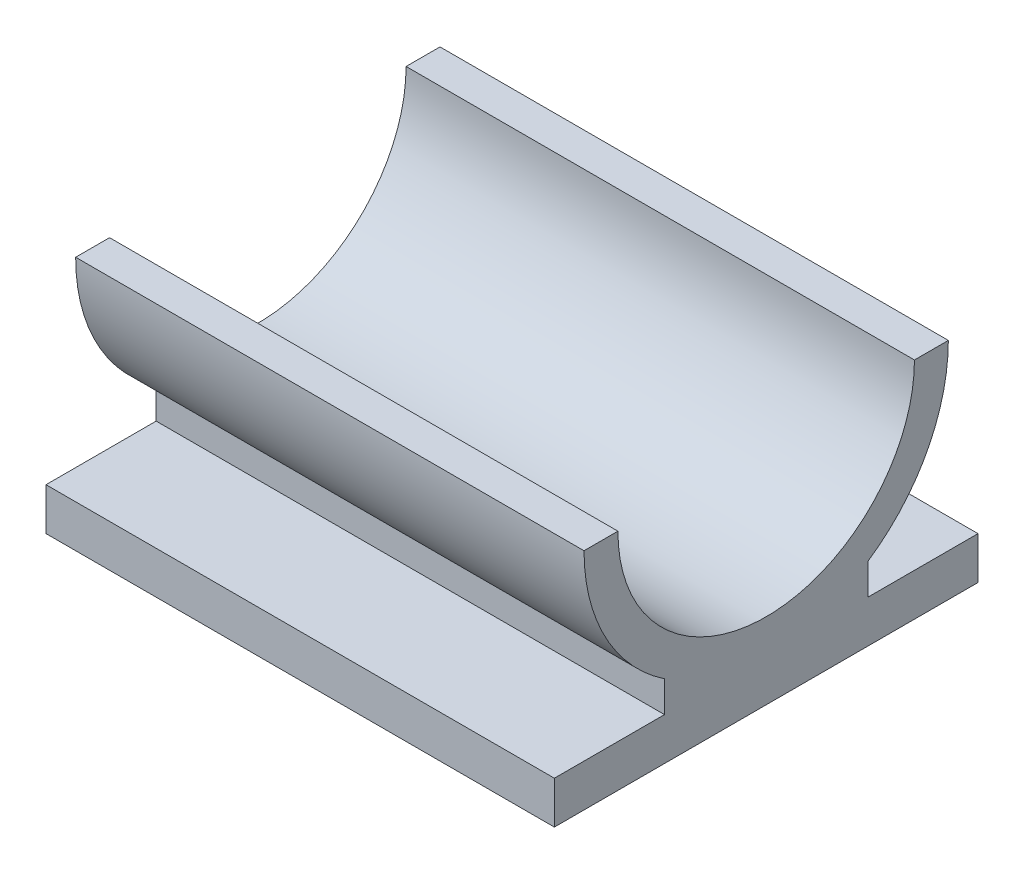
ISO-10303-21;
HEADER;
FILE_DESCRIPTION(('STEP AP214'),'2;1');
FILE_NAME('part.step','',(''),(''),'','','');
FILE_SCHEMA(('AUTOMOTIVE_DESIGN { 1 0 10303 214 1 1 1 1 }'));
ENDSEC;
DATA;
#1=APPLICATION_CONTEXT('core data for automotive mechanical design processes');
#2=APPLICATION_PROTOCOL_DEFINITION('international standard','automotive_design',2000,#1);
#3=PRODUCT_CONTEXT('',#1,'mechanical');
#4=PRODUCT('Part','Part','',(#3));
#5=PRODUCT_RELATED_PRODUCT_CATEGORY('part','',(#4));
#6=PRODUCT_DEFINITION_FORMATION('','',#4);
#7=PRODUCT_DEFINITION_CONTEXT('part definition',#1,'design');
#8=PRODUCT_DEFINITION('design','',#6,#7);
#9=PRODUCT_DEFINITION_SHAPE('','',#8);
#10=(LENGTH_UNIT() NAMED_UNIT(*) SI_UNIT(.MILLI.,.METRE.));
#11=(NAMED_UNIT(*) PLANE_ANGLE_UNIT() SI_UNIT($,.RADIAN.));
#12=(NAMED_UNIT(*) SI_UNIT($,.STERADIAN.) SOLID_ANGLE_UNIT());
#13=UNCERTAINTY_MEASURE_WITH_UNIT(LENGTH_MEASURE(1.E-05),#10,'distance_accuracy_value','');
#14=(GEOMETRIC_REPRESENTATION_CONTEXT(3) GLOBAL_UNCERTAINTY_ASSIGNED_CONTEXT((#13)) GLOBAL_UNIT_ASSIGNED_CONTEXT((#10,
#11,#12)) REPRESENTATION_CONTEXT('',''));
#15=CARTESIAN_POINT('',(0.,0.,0.));
#16=DIRECTION('',(0.,0.,1.));
#17=DIRECTION('',(1.,0.,0.));
#18=AXIS2_PLACEMENT_3D('',#15,#16,#17);
#19=CARTESIAN_POINT('',(0.,6.35,0.));
#20=DIRECTION('',(0.,-1.,0.));
#21=DIRECTION('',(0.,0.,-1.));
#22=AXIS2_PLACEMENT_3D('',#19,#20,#21);
#23=PLANE('',#22);
#24=DIRECTION('',(1.,0.,0.));
#25=VECTOR('',#24,1.);
#26=CARTESIAN_POINT('',(-38.1,6.35,15.24));
#27=LINE('',#26,#25);
#28=CARTESIAN_POINT('',(-38.1,6.35,15.24));
#29=VERTEX_POINT('',#28);
#30=CARTESIAN_POINT('',(38.1,6.35,15.24));
#31=VERTEX_POINT('',#30);
#32=EDGE_CURVE('E191',#29,#31,#27,.T.);
#33=ORIENTED_EDGE('',*,*,#32,.F.);
#34=DIRECTION('',(0.,0.,1.));
#35=VECTOR('',#34,1.);
#36=CARTESIAN_POINT('',(-38.1,6.35,31.75));
#37=LINE('',#36,#35);
#38=CARTESIAN_POINT('',(-38.1,6.35,31.75));
#39=VERTEX_POINT('',#38);
#40=EDGE_CURVE('E203',#29,#39,#37,.T.);
#41=ORIENTED_EDGE('',*,*,#40,.T.);
#42=DIRECTION('',(1.,0.,0.));
#43=VECTOR('',#42,1.);
#44=CARTESIAN_POINT('',(-38.1,6.35,31.75));
#45=LINE('',#44,#43);
#46=CARTESIAN_POINT('',(38.1,6.35,31.75));
#47=VERTEX_POINT('',#46);
#48=EDGE_CURVE('E63',#39,#47,#45,.T.);
#49=ORIENTED_EDGE('',*,*,#48,.T.);
#50=DIRECTION('',(0.,0.,-1.));
#51=VECTOR('',#50,1.);
#52=CARTESIAN_POINT('',(38.1,6.35,31.75));
#53=LINE('',#52,#51);
#54=EDGE_CURVE('E199',#47,#31,#53,.T.);
#55=ORIENTED_EDGE('',*,*,#54,.T.);
#56=EDGE_LOOP('',(#33,#41,#49,#55));
#57=FACE_BOUND('',#56,.T.);
#58=ADVANCED_FACE('F39',(#57),#23,.F.);
#59=CARTESIAN_POINT('',(38.1,6.35,31.75));
#60=DIRECTION('',(-1.,0.,0.));
#61=DIRECTION('',(0.,0.,1.));
#62=AXIS2_PLACEMENT_3D('',#59,#60,#61);
#63=PLANE('',#62);
#64=DIRECTION('',(0.,1.,0.));
#65=VECTOR('',#64,1.);
#66=CARTESIAN_POINT('',(38.1,11.176,-15.24));
#67=LINE('',#66,#65);
#68=CARTESIAN_POINT('',(38.1,6.35,-15.24));
#69=VERTEX_POINT('',#68);
#70=CARTESIAN_POINT('',(38.1,10.9987552758627,-15.24));
#71=VERTEX_POINT('',#70);
#72=EDGE_CURVE('E54',#69,#71,#67,.T.);
#73=ORIENTED_EDGE('',*,*,#72,.T.);
#74=CARTESIAN_POINT('',(38.1,33.655,0.));
#75=DIRECTION('',(1.,0.,0.));
#76=DIRECTION('',(0.,0.,-1.));
#77=AXIS2_PLACEMENT_3D('',#74,#75,#76);
#78=CIRCLE('',#77,27.305);
#79=CARTESIAN_POINT('',(38.1,33.655,-27.305));
#80=VERTEX_POINT('',#79);
#81=EDGE_CURVE('E175',#71,#80,#78,.T.);
#82=ORIENTED_EDGE('',*,*,#81,.T.);
#83=DIRECTION('',(0.,0.,1.));
#84=VECTOR('',#83,1.);
#85=CARTESIAN_POINT('',(38.1,33.655,-22.225));
#86=LINE('',#85,#84);
#87=CARTESIAN_POINT('',(38.1,33.655,-22.225));
#88=VERTEX_POINT('',#87);
#89=EDGE_CURVE('E164',#80,#88,#86,.T.);
#90=ORIENTED_EDGE('',*,*,#89,.T.);
#91=CARTESIAN_POINT('',(38.1,33.655,0.));
#92=DIRECTION('',(-1.,0.,0.));
#93=DIRECTION('',(0.,0.,-1.));
#94=AXIS2_PLACEMENT_3D('',#91,#92,#93);
#95=CIRCLE('',#94,22.225);
#96=CARTESIAN_POINT('',(38.1,33.655,22.225));
#97=VERTEX_POINT('',#96);
#98=EDGE_CURVE('E172',#88,#97,#95,.T.);
#99=ORIENTED_EDGE('',*,*,#98,.T.);
#100=DIRECTION('',(0.,0.,1.));
#101=VECTOR('',#100,1.);
#102=CARTESIAN_POINT('',(38.1,33.655,27.305));
#103=LINE('',#102,#101);
#104=CARTESIAN_POINT('',(38.1,33.655,27.305));
#105=VERTEX_POINT('',#104);
#106=EDGE_CURVE('E143',#97,#105,#103,.T.);
#107=ORIENTED_EDGE('',*,*,#106,.T.);
#108=CARTESIAN_POINT('',(38.1,10.9987552758627,15.24));
#109=VERTEX_POINT('',#108);
#110=EDGE_CURVE('E167',#105,#109,#78,.T.);
#111=ORIENTED_EDGE('',*,*,#110,.T.);
#112=DIRECTION('',(0.,-1.,0.));
#113=VECTOR('',#112,1.);
#114=CARTESIAN_POINT('',(38.1,11.176,15.24));
#115=LINE('',#114,#113);
#116=EDGE_CURVE('E189',#109,#31,#115,.T.);
#117=ORIENTED_EDGE('',*,*,#116,.T.);
#118=ORIENTED_EDGE('',*,*,#54,.F.);
#119=DIRECTION('',(0.,-1.,0.));
#120=VECTOR('',#119,1.);
#121=CARTESIAN_POINT('',(38.1,6.35,31.75));
#122=LINE('',#121,#120);
#123=CARTESIAN_POINT('',(38.1,0.,31.75));
#124=VERTEX_POINT('',#123);
#125=EDGE_CURVE('E208',#47,#124,#122,.T.);
#126=ORIENTED_EDGE('',*,*,#125,.T.);
#127=DIRECTION('',(0.,0.,-1.));
#128=VECTOR('',#127,1.);
#129=CARTESIAN_POINT('',(38.1,0.,31.75));
#130=LINE('',#129,#128);
#131=CARTESIAN_POINT('',(38.1,0.,-31.75));
#132=VERTEX_POINT('',#131);
#133=EDGE_CURVE('E196',#124,#132,#130,.T.);
#134=ORIENTED_EDGE('',*,*,#133,.T.);
#135=DIRECTION('',(0.,-1.,0.));
#136=VECTOR('',#135,1.);
#137=CARTESIAN_POINT('',(38.1,6.35,-31.75));
#138=LINE('',#137,#136);
#139=CARTESIAN_POINT('',(38.1,6.35,-31.75));
#140=VERTEX_POINT('',#139);
#141=EDGE_CURVE('E47',#140,#132,#138,.T.);
#142=ORIENTED_EDGE('',*,*,#141,.F.);
#143=EDGE_CURVE('E91',#69,#140,#53,.T.);
#144=ORIENTED_EDGE('',*,*,#143,.F.);
#145=EDGE_LOOP('',(#73,#82,#90,#99,#107,#111,#117,#118,#126,#134,#142,#144));
#146=FACE_BOUND('',#145,.T.);
#147=ADVANCED_FACE('F41',(#146),#63,.F.);
#148=CARTESIAN_POINT('',(-38.1,6.35,-31.75));
#149=DIRECTION('',(0.,0.,1.));
#150=DIRECTION('',(1.,0.,0.));
#151=AXIS2_PLACEMENT_3D('',#148,#149,#150);
#152=PLANE('',#151);
#153=DIRECTION('',(-1.,0.,0.));
#154=VECTOR('',#153,1.);
#155=CARTESIAN_POINT('',(-38.1,0.,-31.75));
#156=LINE('',#155,#154);
#157=CARTESIAN_POINT('',(-38.1,0.,-31.75));
#158=VERTEX_POINT('',#157);
#159=EDGE_CURVE('E211',#132,#158,#156,.T.);
#160=ORIENTED_EDGE('',*,*,#159,.T.);
#161=DIRECTION('',(0.,-1.,0.));
#162=VECTOR('',#161,1.);
#163=CARTESIAN_POINT('',(-38.1,6.35,-31.75));
#164=LINE('',#163,#162);
#165=CARTESIAN_POINT('',(-38.1,6.35,-31.75));
#166=VERTEX_POINT('',#165);
#167=EDGE_CURVE('E219',#166,#158,#164,.T.);
#168=ORIENTED_EDGE('',*,*,#167,.F.);
#169=DIRECTION('',(-1.,0.,0.));
#170=VECTOR('',#169,1.);
#171=CARTESIAN_POINT('',(-38.1,6.35,-31.75));
#172=LINE('',#171,#170);
#173=EDGE_CURVE('E201',#140,#166,#172,.T.);
#174=ORIENTED_EDGE('',*,*,#173,.F.);
#175=ORIENTED_EDGE('',*,*,#141,.T.);
#176=EDGE_LOOP('',(#160,#168,#174,#175));
#177=FACE_BOUND('',#176,.T.);
#178=ADVANCED_FACE('F224',(#177),#152,.F.);
#179=CARTESIAN_POINT('',(-38.1,6.35,31.75));
#180=DIRECTION('',(1.,0.,0.));
#181=DIRECTION('',(0.,0.,-1.));
#182=AXIS2_PLACEMENT_3D('',#179,#180,#181);
#183=PLANE('',#182);
#184=DIRECTION('',(0.,-1.,0.));
#185=VECTOR('',#184,1.);
#186=CARTESIAN_POINT('',(-38.1,11.176,15.24));
#187=LINE('',#186,#185);
#188=CARTESIAN_POINT('',(-38.1,10.9987552758627,15.24));
#189=VERTEX_POINT('',#188);
#190=EDGE_CURVE('E188',#189,#29,#187,.T.);
#191=ORIENTED_EDGE('',*,*,#190,.F.);
#192=CARTESIAN_POINT('',(-38.1,33.655,0.));
#193=DIRECTION('',(1.,0.,0.));
#194=DIRECTION('',(0.,0.,-1.));
#195=AXIS2_PLACEMENT_3D('',#192,#193,#194);
#196=CIRCLE('',#195,27.305);
#197=CARTESIAN_POINT('',(-38.1,33.655,27.305));
#198=VERTEX_POINT('',#197);
#199=EDGE_CURVE('E159',#198,#189,#196,.T.);
#200=ORIENTED_EDGE('',*,*,#199,.F.);
#201=DIRECTION('',(0.,0.,1.));
#202=VECTOR('',#201,1.);
#203=CARTESIAN_POINT('',(-38.1,33.655,27.305));
#204=LINE('',#203,#202);
#205=CARTESIAN_POINT('',(-38.1,33.655,22.225));
#206=VERTEX_POINT('',#205);
#207=EDGE_CURVE('E141',#206,#198,#204,.T.);
#208=ORIENTED_EDGE('',*,*,#207,.F.);
#209=CARTESIAN_POINT('',(-38.1,33.655,0.));
#210=DIRECTION('',(-1.,0.,0.));
#211=DIRECTION('',(0.,0.,-1.));
#212=AXIS2_PLACEMENT_3D('',#209,#210,#211);
#213=CIRCLE('',#212,22.225);
#214=CARTESIAN_POINT('',(-38.1,33.655,-22.225));
#215=VERTEX_POINT('',#214);
#216=EDGE_CURVE('E157',#215,#206,#213,.T.);
#217=ORIENTED_EDGE('',*,*,#216,.F.);
#218=DIRECTION('',(0.,0.,1.));
#219=VECTOR('',#218,1.);
#220=CARTESIAN_POINT('',(-38.1,33.655,-22.225));
#221=LINE('',#220,#219);
#222=CARTESIAN_POINT('',(-38.1,33.655,-27.305));
#223=VERTEX_POINT('',#222);
#224=EDGE_CURVE('E149',#223,#215,#221,.T.);
#225=ORIENTED_EDGE('',*,*,#224,.F.);
#226=CARTESIAN_POINT('',(-38.1,10.9987552758627,-15.24));
#227=VERTEX_POINT('',#226);
#228=EDGE_CURVE('E160',#227,#223,#196,.T.);
#229=ORIENTED_EDGE('',*,*,#228,.F.);
#230=DIRECTION('',(0.,1.,0.));
#231=VECTOR('',#230,1.);
#232=CARTESIAN_POINT('',(-38.1,11.176,-15.24));
#233=LINE('',#232,#231);
#234=CARTESIAN_POINT('',(-38.1,6.35,-15.24));
#235=VERTEX_POINT('',#234);
#236=EDGE_CURVE('E185',#235,#227,#233,.T.);
#237=ORIENTED_EDGE('',*,*,#236,.F.);
#238=EDGE_CURVE('E204',#166,#235,#37,.T.);
#239=ORIENTED_EDGE('',*,*,#238,.F.);
#240=ORIENTED_EDGE('',*,*,#167,.T.);
#241=DIRECTION('',(0.,0.,1.));
#242=VECTOR('',#241,1.);
#243=CARTESIAN_POINT('',(-38.1,0.,31.75));
#244=LINE('',#243,#242);
#245=CARTESIAN_POINT('',(-38.1,0.,31.75));
#246=VERTEX_POINT('',#245);
#247=EDGE_CURVE('E213',#158,#246,#244,.T.);
#248=ORIENTED_EDGE('',*,*,#247,.T.);
#249=DIRECTION('',(0.,-1.,0.));
#250=VECTOR('',#249,1.);
#251=CARTESIAN_POINT('',(-38.1,6.35,31.75));
#252=LINE('',#251,#250);
#253=EDGE_CURVE('E217',#39,#246,#252,.T.);
#254=ORIENTED_EDGE('',*,*,#253,.F.);
#255=ORIENTED_EDGE('',*,*,#40,.F.);
#256=EDGE_LOOP('',(#191,#200,#208,#217,#225,#229,#237,#239,#240,#248,#254,#255));
#257=FACE_BOUND('',#256,.T.);
#258=ADVANCED_FACE('F155',(#257),#183,.F.);
#259=CARTESIAN_POINT('',(-38.1,6.35,31.75));
#260=DIRECTION('',(0.,0.,-1.));
#261=DIRECTION('',(-1.,0.,0.));
#262=AXIS2_PLACEMENT_3D('',#259,#260,#261);
#263=PLANE('',#262);
#264=DIRECTION('',(1.,0.,0.));
#265=VECTOR('',#264,1.);
#266=CARTESIAN_POINT('',(-38.1,0.,31.75));
#267=LINE('',#266,#265);
#268=EDGE_CURVE('E84',#246,#124,#267,.T.);
#269=ORIENTED_EDGE('',*,*,#268,.T.);
#270=ORIENTED_EDGE('',*,*,#125,.F.);
#271=ORIENTED_EDGE('',*,*,#48,.F.);
#272=ORIENTED_EDGE('',*,*,#253,.T.);
#273=EDGE_LOOP('',(#269,#270,#271,#272));
#274=FACE_BOUND('',#273,.T.);
#275=ADVANCED_FACE('F235',(#274),#263,.F.);
#276=ORIENTED_EDGE('',*,*,#238,.T.);
#277=DIRECTION('',(1.,0.,0.));
#278=VECTOR('',#277,1.);
#279=CARTESIAN_POINT('',(-38.1,6.35,-15.24));
#280=LINE('',#279,#278);
#281=EDGE_CURVE('E194',#235,#69,#280,.T.);
#282=ORIENTED_EDGE('',*,*,#281,.T.);
#283=ORIENTED_EDGE('',*,*,#143,.T.);
#284=ORIENTED_EDGE('',*,*,#173,.T.);
#285=EDGE_LOOP('',(#276,#282,#283,#284));
#286=FACE_BOUND('',#285,.T.);
#287=ADVANCED_FACE('F252',(#286),#23,.F.);
#288=CARTESIAN_POINT('',(0.,0.,0.));
#289=DIRECTION('',(0.,-1.,0.));
#290=DIRECTION('',(0.,0.,-1.));
#291=AXIS2_PLACEMENT_3D('',#288,#289,#290);
#292=PLANE('',#291);
#293=ORIENTED_EDGE('',*,*,#133,.F.);
#294=ORIENTED_EDGE('',*,*,#268,.F.);
#295=ORIENTED_EDGE('',*,*,#247,.F.);
#296=ORIENTED_EDGE('',*,*,#159,.F.);
#297=EDGE_LOOP('',(#293,#294,#295,#296));
#298=FACE_BOUND('',#297,.T.);
#299=ADVANCED_FACE('F230',(#298),#292,.T.);
#300=CARTESIAN_POINT('',(-38.1,11.176,-15.24));
#301=DIRECTION('',(0.,0.,-1.));
#302=DIRECTION('',(0.,1.,0.));
#303=AXIS2_PLACEMENT_3D('',#300,#301,#302);
#304=PLANE('',#303);
#305=DIRECTION('',(1.,0.,0.));
#306=VECTOR('',#305,1.);
#307=CARTESIAN_POINT('',(-38.1,10.9987552758627,-15.24));
#308=LINE('',#307,#306);
#309=EDGE_CURVE('E179',#71,#227,#308,.F.);
#310=ORIENTED_EDGE('',*,*,#309,.F.);
#311=ORIENTED_EDGE('',*,*,#72,.F.);
#312=ORIENTED_EDGE('',*,*,#281,.F.);
#313=ORIENTED_EDGE('',*,*,#236,.T.);
#314=EDGE_LOOP('',(#310,#311,#312,#313));
#315=FACE_BOUND('',#314,.T.);
#316=ADVANCED_FACE('F251',(#315),#304,.T.);
#317=CARTESIAN_POINT('',(-38.1,11.176,15.24));
#318=DIRECTION('',(0.,0.,1.));
#319=DIRECTION('',(1.,0.,0.));
#320=AXIS2_PLACEMENT_3D('',#317,#318,#319);
#321=PLANE('',#320);
#322=DIRECTION('',(1.,0.,0.));
#323=VECTOR('',#322,1.);
#324=CARTESIAN_POINT('',(-38.1,10.9987552758627,15.24));
#325=LINE('',#324,#323);
#326=EDGE_CURVE('E11',#189,#109,#325,.T.);
#327=ORIENTED_EDGE('',*,*,#326,.F.);
#328=ORIENTED_EDGE('',*,*,#190,.T.);
#329=ORIENTED_EDGE('',*,*,#32,.T.);
#330=ORIENTED_EDGE('',*,*,#116,.F.);
#331=EDGE_LOOP('',(#327,#328,#329,#330));
#332=FACE_BOUND('',#331,.T.);
#333=ADVANCED_FACE('F240',(#332),#321,.T.);
#334=CARTESIAN_POINT('',(-38.1,33.655,0.));
#335=DIRECTION('',(1.,0.,0.));
#336=DIRECTION('',(0.,0.,-1.));
#337=AXIS2_PLACEMENT_3D('',#334,#335,#336);
#338=CYLINDRICAL_SURFACE('',#337,27.305);
#339=ORIENTED_EDGE('',*,*,#81,.F.);
#340=ORIENTED_EDGE('',*,*,#309,.T.);
#341=ORIENTED_EDGE('',*,*,#228,.T.);
#342=DIRECTION('',(1.,0.,0.));
#343=VECTOR('',#342,1.);
#344=CARTESIAN_POINT('',(-38.1,33.655,-27.305));
#345=LINE('',#344,#343);
#346=EDGE_CURVE('E180',#223,#80,#345,.T.);
#347=ORIENTED_EDGE('',*,*,#346,.T.);
#348=EDGE_LOOP('',(#339,#340,#341,#347));
#349=FACE_BOUND('',#348,.T.);
#350=ADVANCED_FACE('F307',(#349),#338,.T.);
#351=CARTESIAN_POINT('',(-38.1,33.655,0.));
#352=DIRECTION('',(1.,0.,0.));
#353=DIRECTION('',(0.,0.,-1.));
#354=AXIS2_PLACEMENT_3D('',#351,#352,#353);
#355=CYLINDRICAL_SURFACE('',#354,22.225);
#356=ORIENTED_EDGE('',*,*,#98,.F.);
#357=DIRECTION('',(1.,0.,0.));
#358=VECTOR('',#357,1.);
#359=CARTESIAN_POINT('',(-38.1,33.655,-22.225));
#360=LINE('',#359,#358);
#361=EDGE_CURVE('E163',#215,#88,#360,.T.);
#362=ORIENTED_EDGE('',*,*,#361,.F.);
#363=ORIENTED_EDGE('',*,*,#216,.T.);
#364=DIRECTION('',(1.,0.,0.));
#365=VECTOR('',#364,1.);
#366=CARTESIAN_POINT('',(-38.1,33.655,22.225));
#367=LINE('',#366,#365);
#368=EDGE_CURVE('E138',#206,#97,#367,.T.);
#369=ORIENTED_EDGE('',*,*,#368,.T.);
#370=EDGE_LOOP('',(#356,#362,#363,#369));
#371=FACE_BOUND('',#370,.T.);
#372=ADVANCED_FACE('F162',(#371),#355,.F.);
#373=CARTESIAN_POINT('',(-38.1,33.655,-22.225));
#374=DIRECTION('',(0.,1.,0.));
#375=DIRECTION('',(0.,0.,1.));
#376=AXIS2_PLACEMENT_3D('',#373,#374,#375);
#377=PLANE('',#376);
#378=ORIENTED_EDGE('',*,*,#89,.F.);
#379=ORIENTED_EDGE('',*,*,#346,.F.);
#380=ORIENTED_EDGE('',*,*,#224,.T.);
#381=ORIENTED_EDGE('',*,*,#361,.T.);
#382=EDGE_LOOP('',(#378,#379,#380,#381));
#383=FACE_BOUND('',#382,.T.);
#384=ADVANCED_FACE('F247',(#383),#377,.T.);
#385=ORIENTED_EDGE('',*,*,#199,.T.);
#386=ORIENTED_EDGE('',*,*,#326,.T.);
#387=ORIENTED_EDGE('',*,*,#110,.F.);
#388=DIRECTION('',(1.,0.,0.));
#389=VECTOR('',#388,1.);
#390=CARTESIAN_POINT('',(-38.1,33.655,27.305));
#391=LINE('',#390,#389);
#392=EDGE_CURVE('E148',#198,#105,#391,.T.);
#393=ORIENTED_EDGE('',*,*,#392,.F.);
#394=EDGE_LOOP('',(#385,#386,#387,#393));
#395=FACE_BOUND('',#394,.T.);
#396=ADVANCED_FACE('F243',(#395),#338,.T.);
#397=CARTESIAN_POINT('',(-38.1,33.655,27.305));
#398=DIRECTION('',(0.,1.,0.));
#399=DIRECTION('',(0.,0.,1.));
#400=AXIS2_PLACEMENT_3D('',#397,#398,#399);
#401=PLANE('',#400);
#402=ORIENTED_EDGE('',*,*,#106,.F.);
#403=ORIENTED_EDGE('',*,*,#368,.F.);
#404=ORIENTED_EDGE('',*,*,#207,.T.);
#405=ORIENTED_EDGE('',*,*,#392,.T.);
#406=EDGE_LOOP('',(#402,#403,#404,#405));
#407=FACE_BOUND('',#406,.T.);
#408=ADVANCED_FACE('F140',(#407),#401,.T.);
#409=CLOSED_SHELL('',(#58,#147,#178,#258,#275,#287,#299,#316,#333,#350,#372,#384,#396,#408));
#410=MANIFOLD_SOLID_BREP('B2',#409);
#411=ADVANCED_BREP_SHAPE_REPRESENTATION('',(#18,#410),#14);
#412=SHAPE_DEFINITION_REPRESENTATION(#9,#411);
ENDSEC;
END-ISO-10303-21;
